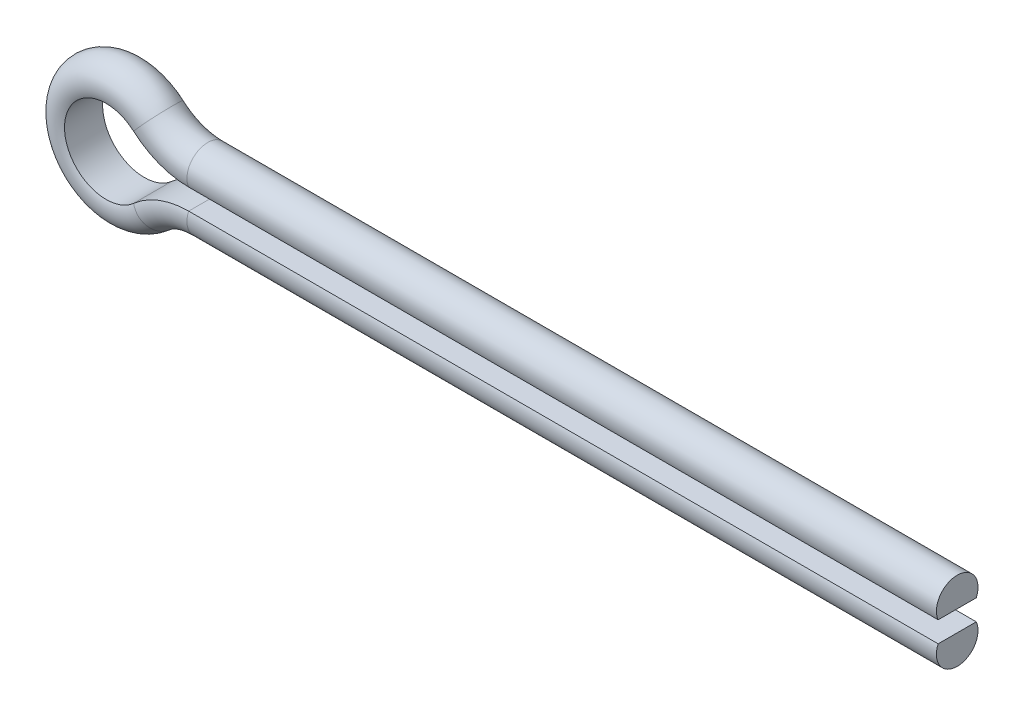
ISO-10303-21;
HEADER;
FILE_DESCRIPTION(('STEP AP214'),'2;1');
FILE_NAME('part.step','',(''),(''),'','','');
FILE_SCHEMA(('AUTOMOTIVE_DESIGN { 1 0 10303 214 1 1 1 1 }'));
ENDSEC;
DATA;
#1=APPLICATION_CONTEXT('core data for automotive mechanical design processes');
#2=APPLICATION_PROTOCOL_DEFINITION('international standard','automotive_design',2000,#1);
#3=PRODUCT_CONTEXT('',#1,'mechanical');
#4=PRODUCT('Part','Part','',(#3));
#5=PRODUCT_RELATED_PRODUCT_CATEGORY('part','',(#4));
#6=PRODUCT_DEFINITION_FORMATION('','',#4);
#7=PRODUCT_DEFINITION_CONTEXT('part definition',#1,'design');
#8=PRODUCT_DEFINITION('design','',#6,#7);
#9=PRODUCT_DEFINITION_SHAPE('','',#8);
#10=(LENGTH_UNIT() NAMED_UNIT(*) SI_UNIT(.MILLI.,.METRE.));
#11=(NAMED_UNIT(*) PLANE_ANGLE_UNIT() SI_UNIT($,.RADIAN.));
#12=(NAMED_UNIT(*) SI_UNIT($,.STERADIAN.) SOLID_ANGLE_UNIT());
#13=UNCERTAINTY_MEASURE_WITH_UNIT(LENGTH_MEASURE(1.E-05),#10,'distance_accuracy_value','');
#14=(GEOMETRIC_REPRESENTATION_CONTEXT(3) GLOBAL_UNCERTAINTY_ASSIGNED_CONTEXT((#13)) GLOBAL_UNIT_ASSIGNED_CONTEXT((#10,
#11,#12)) REPRESENTATION_CONTEXT('',''));
#15=CARTESIAN_POINT('',(0.,0.,0.));
#16=DIRECTION('',(0.,0.,1.));
#17=DIRECTION('',(1.,0.,0.));
#18=AXIS2_PLACEMENT_3D('',#15,#16,#17);
#19=CARTESIAN_POINT('',(96.096654275093,3.49999999999999,0.));
#20=DIRECTION('',(1.,0.,0.));
#21=DIRECTION('',(0.,0.,-1.));
#22=AXIS2_PLACEMENT_3D('',#19,#20,#21);
#23=PLANE('',#22);
#24=CARTESIAN_POINT('',(96.096654275093,3.49999999999999,0.));
#25=DIRECTION('',(1.,0.,0.));
#26=DIRECTION('',(0.,0.,-1.));
#27=AXIS2_PLACEMENT_3D('',#24,#25,#26);
#28=CIRCLE('',#27,2.5);
#29=CARTESIAN_POINT('',(96.096654275093,2.49999999999999,-2.29128784747792));
#30=VERTEX_POINT('',#29);
#31=CARTESIAN_POINT('',(96.096654275093,2.49999999999999,2.29128784747792));
#32=VERTEX_POINT('',#31);
#33=EDGE_CURVE('E88',#30,#32,#28,.T.);
#34=ORIENTED_EDGE('',*,*,#33,.T.);
#35=DIRECTION('',(0.,0.,-1.));
#36=VECTOR('',#35,1.);
#37=CARTESIAN_POINT('',(96.096654275093,2.49999999999999,2.29128784747792));
#38=LINE('',#37,#36);
#39=EDGE_CURVE('E97',#32,#30,#38,.T.);
#40=ORIENTED_EDGE('',*,*,#39,.T.);
#41=EDGE_LOOP('',(#34,#40));
#42=FACE_BOUND('',#41,.T.);
#43=ADVANCED_FACE('F37',(#42),#23,.T.);
#44=CARTESIAN_POINT('',(96.096654275093,-0.999999999999988,0.));
#45=DIRECTION('',(-1.,0.,0.));
#46=DIRECTION('',(0.,0.,-1.));
#47=AXIS2_PLACEMENT_3D('',#44,#45,#46);
#48=PLANE('',#47);
#49=CARTESIAN_POINT('',(96.096654275093,-0.999999999999988,0.));
#50=DIRECTION('',(-1.,0.,0.));
#51=DIRECTION('',(0.,0.,-1.));
#52=AXIS2_PLACEMENT_3D('',#49,#50,#51);
#53=CIRCLE('',#52,2.5);
#54=CARTESIAN_POINT('',(96.096654275093,0.,-2.29128784747792));
#55=VERTEX_POINT('',#54);
#56=CARTESIAN_POINT('',(96.096654275093,0.,2.29128784747792));
#57=VERTEX_POINT('',#56);
#58=EDGE_CURVE('E51',#55,#57,#53,.T.);
#59=ORIENTED_EDGE('',*,*,#58,.F.);
#60=DIRECTION('',(0.,0.,-1.));
#61=VECTOR('',#60,1.);
#62=CARTESIAN_POINT('',(96.096654275093,0.,2.29128784747792));
#63=LINE('',#62,#61);
#64=EDGE_CURVE('E11',#57,#55,#63,.T.);
#65=ORIENTED_EDGE('',*,*,#64,.F.);
#66=EDGE_LOOP('',(#59,#65));
#67=FACE_BOUND('',#66,.T.);
#68=ADVANCED_FACE('F188',(#67),#48,.F.);
#69=CARTESIAN_POINT('',(96.096654275093,3.49999999999999,0.));
#70=DIRECTION('',(-1.,0.,0.));
#71=DIRECTION('',(0.,-1.,0.));
#72=AXIS2_PLACEMENT_3D('',#69,#70,#71);
#73=CYLINDRICAL_SURFACE('',#72,2.5);
#74=DIRECTION('',(-1.,0.,0.));
#75=VECTOR('',#74,1.);
#76=CARTESIAN_POINT('',(96.096654275093,2.49999999999999,2.29128784747792));
#77=LINE('',#76,#75);
#78=CARTESIAN_POINT('',(6.01822169158517,2.49999999999998,2.29128784747792));
#79=VERTEX_POINT('',#78);
#80=EDGE_CURVE('E95',#32,#79,#77,.T.);
#81=ORIENTED_EDGE('',*,*,#80,.F.);
#82=ORIENTED_EDGE('',*,*,#33,.F.);
#83=DIRECTION('',(-1.,0.,0.));
#84=VECTOR('',#83,1.);
#85=CARTESIAN_POINT('',(96.096654275093,2.49999999999999,-2.29128784747792));
#86=LINE('',#85,#84);
#87=CARTESIAN_POINT('',(6.01822169158517,2.49999999999998,-2.29128784747792));
#88=VERTEX_POINT('',#87);
#89=EDGE_CURVE('E93',#30,#88,#86,.T.);
#90=ORIENTED_EDGE('',*,*,#89,.T.);
#91=CARTESIAN_POINT('',(6.01822169158517,3.49999999999998,0.));
#92=DIRECTION('',(1.,0.,0.));
#93=DIRECTION('',(0.,0.,-1.));
#94=AXIS2_PLACEMENT_3D('',#91,#92,#93);
#95=CIRCLE('',#94,2.5);
#96=EDGE_CURVE('E106',#88,#79,#95,.T.);
#97=ORIENTED_EDGE('',*,*,#96,.T.);
#98=EDGE_LOOP('',(#81,#82,#90,#97));
#99=FACE_BOUND('',#98,.T.);
#100=ADVANCED_FACE('F90',(#99),#73,.T.);
#101=CARTESIAN_POINT('',(96.096654275093,2.49999999999999,2.29128784747792));
#102=DIRECTION('',(0.,1.,0.));
#103=DIRECTION('',(-1.,0.,0.));
#104=AXIS2_PLACEMENT_3D('',#101,#102,#103);
#105=PLANE('',#104);
#106=DIRECTION('',(0.,0.,-1.));
#107=VECTOR('',#106,1.);
#108=CARTESIAN_POINT('',(6.01822169158517,2.49999999999998,2.29128784747792));
#109=LINE('',#108,#107);
#110=EDGE_CURVE('E104',#79,#88,#109,.T.);
#111=ORIENTED_EDGE('',*,*,#110,.T.);
#112=ORIENTED_EDGE('',*,*,#89,.F.);
#113=ORIENTED_EDGE('',*,*,#39,.F.);
#114=ORIENTED_EDGE('',*,*,#80,.T.);
#115=EDGE_LOOP('',(#111,#112,#113,#114));
#116=FACE_BOUND('',#115,.T.);
#117=ADVANCED_FACE('F102',(#116),#105,.F.);
#118=CARTESIAN_POINT('',(6.01822169158517,12.5,0.));
#119=DIRECTION('',(0.,0.,-1.));
#120=DIRECTION('',(-1.,0.,0.));
#121=AXIS2_PLACEMENT_3D('',#118,#119,#120);
#122=TOROIDAL_SURFACE('',#121,8.99999999999998,2.5);
#123=CARTESIAN_POINT('',(6.01822169158517,12.5,2.29128784747792));
#124=DIRECTION('',(0.,0.,-1.));
#125=DIRECTION('',(0.,-1.,0.));
#126=AXIS2_PLACEMENT_3D('',#123,#124,#125);
#127=CIRCLE('',#126,9.99999999999998);
#128=CARTESIAN_POINT('',(-0.596156586076283,4.99999999999999,2.29128784747792));
#129=VERTEX_POINT('',#128);
#130=EDGE_CURVE('E114',#79,#129,#127,.T.);
#131=ORIENTED_EDGE('',*,*,#130,.F.);
#132=ORIENTED_EDGE('',*,*,#96,.F.);
#133=CARTESIAN_POINT('',(6.01822169158517,12.5,-2.29128784747792));
#134=DIRECTION('',(0.,0.,-1.));
#135=DIRECTION('',(0.,-1.,0.));
#136=AXIS2_PLACEMENT_3D('',#133,#134,#135);
#137=CIRCLE('',#136,9.99999999999998);
#138=CARTESIAN_POINT('',(-0.596156586076282,5.,-2.29128784747792));
#139=VERTEX_POINT('',#138);
#140=EDGE_CURVE('E115',#88,#139,#137,.T.);
#141=ORIENTED_EDGE('',*,*,#140,.T.);
#142=CARTESIAN_POINT('',(0.0652812416898491,5.74999999999998,0.));
#143=DIRECTION('',(0.749999999999999,-0.661437827766149,0.));
#144=DIRECTION('',(0.,0.,-1.));
#145=AXIS2_PLACEMENT_3D('',#142,#143,#144);
#146=CIRCLE('',#145,2.5);
#147=EDGE_CURVE('E111',#139,#129,#146,.T.);
#148=ORIENTED_EDGE('',*,*,#147,.T.);
#149=EDGE_LOOP('',(#131,#132,#141,#148));
#150=FACE_BOUND('',#149,.T.);
#151=ADVANCED_FACE('F168',(#150),#122,.T.);
#152=CARTESIAN_POINT('',(6.01822169158517,12.5,0.));
#153=DIRECTION('',(0.,0.,-1.));
#154=DIRECTION('',(-1.,0.,0.));
#155=AXIS2_PLACEMENT_3D('',#152,#153,#154);
#156=CYLINDRICAL_SURFACE('',#155,9.99999999999998);
#157=DIRECTION('',(0.,0.,-1.));
#158=VECTOR('',#157,1.);
#159=CARTESIAN_POINT('',(-0.596156586076299,4.99999999999998,2.29128784747792));
#160=LINE('',#159,#158);
#161=EDGE_CURVE('E118',#129,#139,#160,.T.);
#162=ORIENTED_EDGE('',*,*,#161,.T.);
#163=ORIENTED_EDGE('',*,*,#140,.F.);
#164=ORIENTED_EDGE('',*,*,#110,.F.);
#165=ORIENTED_EDGE('',*,*,#130,.T.);
#166=EDGE_LOOP('',(#162,#163,#164,#165));
#167=FACE_BOUND('',#166,.T.);
#168=ADVANCED_FACE('F166',(#167),#156,.T.);
#169=CARTESIAN_POINT('',(-3.90334572490705,1.25,0.));
#170=DIRECTION('',(0.,0.,1.));
#171=DIRECTION('',(1.,0.,0.));
#172=AXIS2_PLACEMENT_3D('',#169,#170,#171);
#173=TOROIDAL_SURFACE('',#172,5.99999999999999,2.5);
#174=CARTESIAN_POINT('',(-3.90334572490705,1.25,2.29128784747792));
#175=DIRECTION('',(0.,0.,1.));
#176=DIRECTION('',(0.661437827766152,0.749999999999996,0.));
#177=AXIS2_PLACEMENT_3D('',#174,#175,#176);
#178=CIRCLE('',#177,4.99999999999999);
#179=CARTESIAN_POINT('',(-0.596156586076322,-2.5,2.29128784747792));
#180=VERTEX_POINT('',#179);
#181=EDGE_CURVE('E124',#129,#180,#178,.T.);
#182=ORIENTED_EDGE('',*,*,#181,.F.);
#183=ORIENTED_EDGE('',*,*,#147,.F.);
#184=CARTESIAN_POINT('',(-3.90334572490705,1.25,-2.29128784747792));
#185=DIRECTION('',(0.,0.,1.));
#186=DIRECTION('',(0.661437827766152,0.749999999999996,0.));
#187=AXIS2_PLACEMENT_3D('',#184,#185,#186);
#188=CIRCLE('',#187,4.99999999999999);
#189=CARTESIAN_POINT('',(-0.596156586076322,-2.5,-2.29128784747792));
#190=VERTEX_POINT('',#189);
#191=EDGE_CURVE('E125',#139,#190,#188,.T.);
#192=ORIENTED_EDGE('',*,*,#191,.T.);
#193=CARTESIAN_POINT('',(0.0652812416898213,-3.24999999999999,0.));
#194=DIRECTION('',(-0.75,-0.661437827766148,0.));
#195=DIRECTION('',(0.,0.,-1.));
#196=AXIS2_PLACEMENT_3D('',#193,#194,#195);
#197=CIRCLE('',#196,2.5);
#198=EDGE_CURVE('E121',#190,#180,#197,.T.);
#199=ORIENTED_EDGE('',*,*,#198,.T.);
#200=EDGE_LOOP('',(#182,#183,#192,#199));
#201=FACE_BOUND('',#200,.T.);
#202=ADVANCED_FACE('F161',(#201),#173,.T.);
#203=CARTESIAN_POINT('',(-3.90334572490705,1.25,0.));
#204=DIRECTION('',(0.,0.,1.));
#205=DIRECTION('',(1.,0.,0.));
#206=AXIS2_PLACEMENT_3D('',#203,#204,#205);
#207=CYLINDRICAL_SURFACE('',#206,4.99999999999999);
#208=DIRECTION('',(0.,0.,-1.));
#209=VECTOR('',#208,1.);
#210=CARTESIAN_POINT('',(-0.596156586076327,-2.49999999999999,2.29128784747792));
#211=LINE('',#210,#209);
#212=EDGE_CURVE('E128',#180,#190,#211,.T.);
#213=ORIENTED_EDGE('',*,*,#212,.T.);
#214=ORIENTED_EDGE('',*,*,#191,.F.);
#215=ORIENTED_EDGE('',*,*,#161,.F.);
#216=ORIENTED_EDGE('',*,*,#181,.T.);
#217=EDGE_LOOP('',(#213,#214,#215,#216));
#218=FACE_BOUND('',#217,.T.);
#219=ADVANCED_FACE('F164',(#218),#207,.F.);
#220=CARTESIAN_POINT('',(6.01822169158516,-10.,0.));
#221=DIRECTION('',(0.,0.,-1.));
#222=DIRECTION('',(-1.,0.,0.));
#223=AXIS2_PLACEMENT_3D('',#220,#221,#222);
#224=TOROIDAL_SURFACE('',#223,9.00000000000002,2.5);
#225=CARTESIAN_POINT('',(6.01822169158516,-10.,2.29128784747792));
#226=DIRECTION('',(0.,0.,-1.));
#227=DIRECTION('',(-0.661437827766148,0.75,0.));
#228=AXIS2_PLACEMENT_3D('',#225,#226,#227);
#229=CIRCLE('',#228,10.);
#230=CARTESIAN_POINT('',(6.01822169158515,0.,2.29128784747792));
#231=VERTEX_POINT('',#230);
#232=EDGE_CURVE('E134',#180,#231,#229,.T.);
#233=ORIENTED_EDGE('',*,*,#232,.F.);
#234=ORIENTED_EDGE('',*,*,#198,.F.);
#235=CARTESIAN_POINT('',(6.01822169158516,-10.,-2.29128784747792));
#236=DIRECTION('',(0.,0.,-1.));
#237=DIRECTION('',(-0.661437827766148,0.75,0.));
#238=AXIS2_PLACEMENT_3D('',#235,#236,#237);
#239=CIRCLE('',#238,10.);
#240=CARTESIAN_POINT('',(6.01822169158515,0.,-2.29128784747792));
#241=VERTEX_POINT('',#240);
#242=EDGE_CURVE('E135',#190,#241,#239,.T.);
#243=ORIENTED_EDGE('',*,*,#242,.T.);
#244=CARTESIAN_POINT('',(6.01822169158515,-0.999999999999988,0.));
#245=DIRECTION('',(-1.,0.,0.));
#246=DIRECTION('',(0.,0.,-1.));
#247=AXIS2_PLACEMENT_3D('',#244,#245,#246);
#248=CIRCLE('',#247,2.5);
#249=EDGE_CURVE('E131',#241,#231,#248,.T.);
#250=ORIENTED_EDGE('',*,*,#249,.T.);
#251=EDGE_LOOP('',(#233,#234,#243,#250));
#252=FACE_BOUND('',#251,.T.);
#253=ADVANCED_FACE('F158',(#252),#224,.T.);
#254=CARTESIAN_POINT('',(6.01822169158516,-10.,0.));
#255=DIRECTION('',(0.,0.,-1.));
#256=DIRECTION('',(-1.,0.,0.));
#257=AXIS2_PLACEMENT_3D('',#254,#255,#256);
#258=CYLINDRICAL_SURFACE('',#257,10.);
#259=DIRECTION('',(0.,0.,-1.));
#260=VECTOR('',#259,1.);
#261=CARTESIAN_POINT('',(6.01822169158515,0.,2.29128784747792));
#262=LINE('',#261,#260);
#263=EDGE_CURVE('E138',#231,#241,#262,.T.);
#264=ORIENTED_EDGE('',*,*,#263,.T.);
#265=ORIENTED_EDGE('',*,*,#242,.F.);
#266=ORIENTED_EDGE('',*,*,#212,.F.);
#267=ORIENTED_EDGE('',*,*,#232,.T.);
#268=EDGE_LOOP('',(#264,#265,#266,#267));
#269=FACE_BOUND('',#268,.T.);
#270=ADVANCED_FACE('F153',(#269),#258,.T.);
#271=CARTESIAN_POINT('',(6.01822169158517,-0.999999999999988,0.));
#272=DIRECTION('',(1.,0.,0.));
#273=DIRECTION('',(0.,0.,-1.));
#274=AXIS2_PLACEMENT_3D('',#271,#272,#273);
#275=CYLINDRICAL_SURFACE('',#274,2.5);
#276=DIRECTION('',(1.,0.,0.));
#277=VECTOR('',#276,1.);
#278=CARTESIAN_POINT('',(6.01822169158517,0.,2.29128784747792));
#279=LINE('',#278,#277);
#280=EDGE_CURVE('E44',#231,#57,#279,.T.);
#281=ORIENTED_EDGE('',*,*,#280,.F.);
#282=ORIENTED_EDGE('',*,*,#249,.F.);
#283=DIRECTION('',(1.,0.,0.));
#284=VECTOR('',#283,1.);
#285=CARTESIAN_POINT('',(6.01822169158517,0.,-2.29128784747792));
#286=LINE('',#285,#284);
#287=EDGE_CURVE('E142',#241,#55,#286,.T.);
#288=ORIENTED_EDGE('',*,*,#287,.T.);
#289=ORIENTED_EDGE('',*,*,#58,.T.);
#290=EDGE_LOOP('',(#281,#282,#288,#289));
#291=FACE_BOUND('',#290,.T.);
#292=ADVANCED_FACE('F155',(#291),#275,.T.);
#293=CARTESIAN_POINT('',(6.01822169158517,0.,2.29128784747792));
#294=DIRECTION('',(0.,-1.,0.));
#295=DIRECTION('',(0.,0.,-1.));
#296=AXIS2_PLACEMENT_3D('',#293,#294,#295);
#297=PLANE('',#296);
#298=ORIENTED_EDGE('',*,*,#64,.T.);
#299=ORIENTED_EDGE('',*,*,#287,.F.);
#300=ORIENTED_EDGE('',*,*,#263,.F.);
#301=ORIENTED_EDGE('',*,*,#280,.T.);
#302=EDGE_LOOP('',(#298,#299,#300,#301));
#303=FACE_BOUND('',#302,.T.);
#304=ADVANCED_FACE('F179',(#303),#297,.F.);
#305=CLOSED_SHELL('',(#43,#68,#100,#117,#151,#168,#202,#219,#253,#270,#292,#304));
#306=MANIFOLD_SOLID_BREP('B2',#305);
#307=ADVANCED_BREP_SHAPE_REPRESENTATION('',(#18,#306),#14);
#308=SHAPE_DEFINITION_REPRESENTATION(#9,#307);
ENDSEC;
END-ISO-10303-21;
